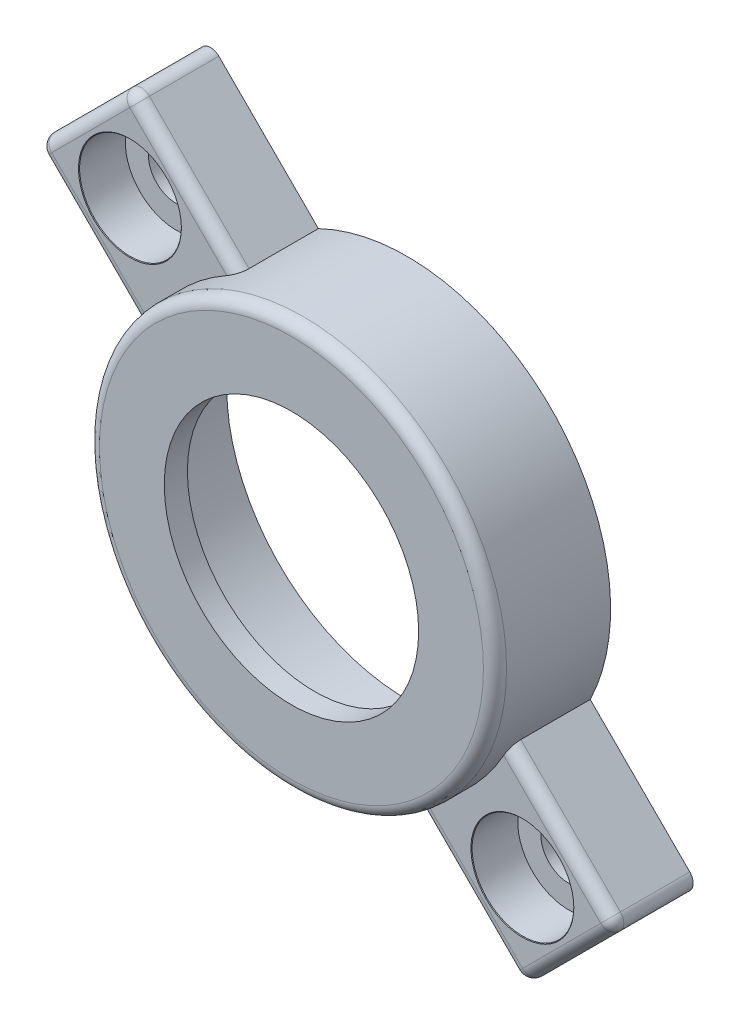
ISO-10303-21;
HEADER;
FILE_DESCRIPTION(('STEP AP214'),'2;1');
FILE_NAME('part.step','',(''),(''),'','','');
FILE_SCHEMA(('AUTOMOTIVE_DESIGN { 1 0 10303 214 1 1 1 1 }'));
ENDSEC;
DATA;
#1=APPLICATION_CONTEXT('core data for automotive mechanical design processes');
#2=APPLICATION_PROTOCOL_DEFINITION('international standard','automotive_design',2000,#1);
#3=PRODUCT_CONTEXT('',#1,'mechanical');
#4=PRODUCT('Part','Part','',(#3));
#5=PRODUCT_RELATED_PRODUCT_CATEGORY('part','',(#4));
#6=PRODUCT_DEFINITION_FORMATION('','',#4);
#7=PRODUCT_DEFINITION_CONTEXT('part definition',#1,'design');
#8=PRODUCT_DEFINITION('design','',#6,#7);
#9=PRODUCT_DEFINITION_SHAPE('','',#8);
#10=(LENGTH_UNIT() NAMED_UNIT(*) SI_UNIT(.MILLI.,.METRE.));
#11=(NAMED_UNIT(*) PLANE_ANGLE_UNIT() SI_UNIT($,.RADIAN.));
#12=(NAMED_UNIT(*) SI_UNIT($,.STERADIAN.) SOLID_ANGLE_UNIT());
#13=UNCERTAINTY_MEASURE_WITH_UNIT(LENGTH_MEASURE(1.E-05),#10,'distance_accuracy_value','');
#14=(GEOMETRIC_REPRESENTATION_CONTEXT(3) GLOBAL_UNCERTAINTY_ASSIGNED_CONTEXT((#13)) GLOBAL_UNIT_ASSIGNED_CONTEXT((#10,
#11,#12)) REPRESENTATION_CONTEXT('',''));
#15=CARTESIAN_POINT('',(0.,0.,0.));
#16=DIRECTION('',(0.,0.,1.));
#17=DIRECTION('',(1.,0.,0.));
#18=AXIS2_PLACEMENT_3D('',#15,#16,#17);
#19=CARTESIAN_POINT('',(0.,0.,5.));
#20=DIRECTION('',(0.,0.,-1.));
#21=DIRECTION('',(-1.,0.,0.));
#22=AXIS2_PLACEMENT_3D('',#19,#20,#21);
#23=CYLINDRICAL_SURFACE('',#22,8.8);
#24=CARTESIAN_POINT('',(0.,0.,4.5));
#25=DIRECTION('',(0.,0.,1.));
#26=DIRECTION('',(1.,0.,0.));
#27=AXIS2_PLACEMENT_3D('',#24,#25,#26);
#28=CIRCLE('',#27,8.8);
#29=CARTESIAN_POINT('',(8.8,0.,4.5));
#30=VERTEX_POINT('',#29);
#31=EDGE_CURVE('E206',#30,#30,#28,.F.);
#32=ORIENTED_EDGE('',*,*,#31,.T.);
#33=EDGE_LOOP('',(#32));
#34=FACE_BOUND('',#33,.T.);
#35=CARTESIAN_POINT('',(0.,0.,0.));
#36=DIRECTION('',(0.,0.,1.));
#37=DIRECTION('',(1.,0.,0.));
#38=AXIS2_PLACEMENT_3D('',#35,#36,#37);
#39=CIRCLE('',#38,8.8);
#40=CARTESIAN_POINT('',(-7.91995561386818,3.83592271485725,0.));
#41=VERTEX_POINT('',#40);
#42=CARTESIAN_POINT('',(3.8359227148572,-7.91995561386821,0.));
#43=VERTEX_POINT('',#42);
#44=EDGE_CURVE('E192',#41,#43,#39,.T.);
#45=ORIENTED_EDGE('',*,*,#44,.T.);
#46=DIRECTION('',(0.,0.,-1.));
#47=VECTOR('',#46,1.);
#48=CARTESIAN_POINT('',(3.8359227148572,-7.91995561386821,3.5));
#49=LINE('',#48,#47);
#50=CARTESIAN_POINT('',(3.8359227148572,-7.91995561386821,3.));
#51=VERTEX_POINT('',#50);
#52=EDGE_CURVE('E184',#51,#43,#49,.T.);
#53=ORIENTED_EDGE('',*,*,#52,.F.);
#54=CARTESIAN_POINT('',(3.8359227148572,-7.91995561386821,3.));
#55=CARTESIAN_POINT('',(3.83589307034447,-7.91996600417581,3.02706634278127));
#56=CARTESIAN_POINT('',(3.83801477132745,-7.91894232403933,3.05411490016184));
#57=CARTESIAN_POINT('',(3.8463298883438,-7.91490897848175,3.10736088939439));
#58=CARTESIAN_POINT('',(3.85251327022096,-7.91190420716805,3.13356025218955));
#59=CARTESIAN_POINT('',(3.86872162558122,-7.90399069907808,3.18442914207294));
#60=CARTESIAN_POINT('',(3.8787460323447,-7.89908224317747,3.20909889422228));
#61=CARTESIAN_POINT('',(3.90224925124192,-7.88749789364705,3.25628559948586));
#62=CARTESIAN_POINT('',(3.91572915892654,-7.8808214394592,3.27880186673306));
#63=CARTESIAN_POINT('',(3.94606868441997,-7.86567451344434,3.32169316164555));
#64=CARTESIAN_POINT('',(3.96300647750629,-7.85716222625641,3.34199801724509));
#65=CARTESIAN_POINT('',(3.9994856726128,-7.83865628567551,3.37933076930461));
#66=CARTESIAN_POINT('',(4.01902785921082,-7.82866218578152,3.39635767448321));
#67=CARTESIAN_POINT('',(4.06119700822396,-7.806873218743,3.42755625430859));
#68=CARTESIAN_POINT('',(4.08393049083422,-7.7950124886105,3.44153791638332));
#69=CARTESIAN_POINT('',(4.13098065695736,-7.77018056625771,3.46517914177813));
#70=CARTESIAN_POINT('',(4.1552971724879,-7.75720949181491,3.4748391628323));
#71=CARTESIAN_POINT('',(4.19981211064155,-7.73318049771603,3.48811888764315));
#72=CARTESIAN_POINT('',(4.21984647073165,-7.72226755317064,3.49256594864601));
#73=CARTESIAN_POINT('',(4.2601397293333,-7.70011339232452,3.49850713601997));
#74=CARTESIAN_POINT('',(4.28039835035997,-7.68887255851719,3.50000457360893));
#75=CARTESIAN_POINT('',(4.30061804745866,-7.67754416528312,3.5));
#76=B_SPLINE_CURVE_WITH_KNOTS('',3,(#54,#55,#56,#57,#58,#59,#60,#61,#62,#63,#64,#65,#66,#67,#68,
#69,#70,#71,#72,#73,#74,#75),.UNSPECIFIED.,.F.,.F.,(4,2,2,2,2,2,2,2,2,2,4),(0.,
0.0810692484083578,0.161938969204339,0.242796762761334,0.323680223689289,0.40664901721923,
0.489642861973184,0.576871359676845,0.664090616234582,0.733635085488818,0.803101440221302),.UNSPECIFIED.);
#77=CARTESIAN_POINT('',(4.30061804745866,-7.67754416528312,3.5));
#78=VERTEX_POINT('',#77);
#79=EDGE_CURVE('E11',#51,#78,#76,.T.);
#80=ORIENTED_EDGE('',*,*,#79,.T.);
#81=CARTESIAN_POINT('',(0.,0.,3.5));
#82=DIRECTION('',(0.,0.,1.));
#83=DIRECTION('',(1.,0.,0.));
#84=AXIS2_PLACEMENT_3D('',#81,#82,#83);
#85=CIRCLE('',#84,8.8);
#86=CARTESIAN_POINT('',(7.67754416528312,-4.30061804745865,3.5));
#87=VERTEX_POINT('',#86);
#88=EDGE_CURVE('E173',#78,#87,#85,.T.);
#89=ORIENTED_EDGE('',*,*,#88,.T.);
#90=CARTESIAN_POINT('',(7.67754416528312,-4.30061804745865,3.5));
#91=CARTESIAN_POINT('',(7.69239130558122,-4.27412495728988,3.50001798088771));
#92=CARTESIAN_POINT('',(7.70708703154954,-4.24755621536626,3.49743772900287));
#93=CARTESIAN_POINT('',(7.73580463075034,-4.1950202341839,3.48725917887673));
#94=CARTESIAN_POINT('',(7.74982648187858,-4.16905301467057,3.47966071614995));
#95=CARTESIAN_POINT('',(7.77683092664298,-4.11846227802681,3.45961925682563));
#96=CARTESIAN_POINT('',(7.78981300557566,-4.09383942827666,3.44717387858157));
#97=CARTESIAN_POINT('',(7.81439839004262,-4.04671256308781,3.41774628657881));
#98=CARTESIAN_POINT('',(7.82600210275842,-4.02420792232142,3.40076541748349));
#99=CARTESIAN_POINT('',(7.84740952026313,-3.98229993880003,3.36288932243528));
#100=CARTESIAN_POINT('',(7.85723193962856,-3.96286466752868,3.34204009540808));
#101=CARTESIAN_POINT('',(7.87496625121789,-3.92750541784252,3.29682941655514));
#102=CARTESIAN_POINT('',(7.88287811504157,-3.91158149162381,3.27246791252833));
#103=CARTESIAN_POINT('',(7.89625486200306,-3.88450488849055,3.22204415076297));
#104=CARTESIAN_POINT('',(7.90181049240829,-3.87317619053987,3.19610040566682));
#105=CARTESIAN_POINT('',(7.9107766125548,-3.85483060751618,3.1423983489206));
#106=CARTESIAN_POINT('',(7.91419010220146,-3.84780769283975,3.11464263524664));
#107=CARTESIAN_POINT('',(7.9176359441669,-3.84070921759787,3.07218141213826));
#108=CARTESIAN_POINT('',(7.91850556675559,-3.83891550580424,3.05780798615238));
#109=CARTESIAN_POINT('',(7.91966500579357,-3.83652278332807,3.02895897925885));
#110=CARTESIAN_POINT('',(7.91995562415094,-3.83592212030286,3.01448356754118));
#111=CARTESIAN_POINT('',(7.91995561386827,-3.83592271485721,3.));
#112=B_SPLINE_CURVE_WITH_KNOTS('',3,(#90,#91,#92,#93,#94,#95,#96,#97,#98,#99,#100,#101,#102,
#103,#104,#105,#106,#107,#108,#109,#110,#111),.UNSPECIFIED.,.F.,.F.,(4,2,2,2,2,2,2,2,2,2,4),(0.,
0.0909891913649377,0.18198136529573,0.273018306909071,0.36402828817203,0.454018363278204,
0.544009775995821,0.630123601092977,0.716116559613162,0.759596167160493,0.803015514433935),.UNSPECIFIED.);
#113=CARTESIAN_POINT('',(7.91995561386821,-3.8359227148572,3.));
#114=VERTEX_POINT('',#113);
#115=EDGE_CURVE('E56',#87,#114,#112,.T.);
#116=ORIENTED_EDGE('',*,*,#115,.T.);
#117=DIRECTION('',(0.,0.,-1.));
#118=VECTOR('',#117,1.);
#119=CARTESIAN_POINT('',(7.91995561386821,-3.8359227148572,3.5));
#120=LINE('',#119,#118);
#121=CARTESIAN_POINT('',(7.91995561386821,-3.8359227148572,0.));
#122=VERTEX_POINT('',#121);
#123=EDGE_CURVE('E166',#114,#122,#120,.T.);
#124=ORIENTED_EDGE('',*,*,#123,.T.);
#125=CARTESIAN_POINT('',(-3.83592271485714,7.91995561386824,0.));
#126=VERTEX_POINT('',#125);
#127=EDGE_CURVE('E180',#122,#126,#39,.T.);
#128=ORIENTED_EDGE('',*,*,#127,.T.);
#129=DIRECTION('',(0.,0.,-1.));
#130=VECTOR('',#129,1.);
#131=CARTESIAN_POINT('',(-3.83592271485714,7.91995561386824,3.5));
#132=LINE('',#131,#130);
#133=CARTESIAN_POINT('',(-3.83592271485714,7.91995561386824,3.));
#134=VERTEX_POINT('',#133);
#135=EDGE_CURVE('E478',#134,#126,#132,.T.);
#136=ORIENTED_EDGE('',*,*,#135,.F.);
#137=CARTESIAN_POINT('',(-3.83592271485714,7.91995561386824,3.));
#138=CARTESIAN_POINT('',(-3.83589307034441,7.91996600417584,3.02706634278127));
#139=CARTESIAN_POINT('',(-3.8380147713274,7.91894232403936,3.05411490016184));
#140=CARTESIAN_POINT('',(-3.84632988834374,7.91490897848178,3.10736088939439));
#141=CARTESIAN_POINT('',(-3.8525132702209,7.91190420716808,3.13356025218955));
#142=CARTESIAN_POINT('',(-3.86872162558117,7.9039906990781,3.18442914207294));
#143=CARTESIAN_POINT('',(-3.87874603234464,7.8990822431775,3.20909889422228));
#144=CARTESIAN_POINT('',(-3.90224925124186,7.88749789364708,3.25628559948586));
#145=CARTESIAN_POINT('',(-3.91572915892649,7.88082143945923,3.27880186673306));
#146=CARTESIAN_POINT('',(-3.94606868441991,7.86567451344437,3.32169316164555));
#147=CARTESIAN_POINT('',(-3.96300647750623,7.85716222625643,3.34199801724509));
#148=CARTESIAN_POINT('',(-3.99948567261275,7.83865628567554,3.37933076930461));
#149=CARTESIAN_POINT('',(-4.01902785921076,7.82866218578155,3.39635767448321));
#150=CARTESIAN_POINT('',(-4.06119700822391,7.80687321874303,3.42755625430859));
#151=CARTESIAN_POINT('',(-4.08393049083416,7.79501248861053,3.44153791638333));
#152=CARTESIAN_POINT('',(-4.1309806569573,7.77018056625773,3.46517914177814));
#153=CARTESIAN_POINT('',(-4.15529717248785,7.75720949181494,3.4748391628323));
#154=CARTESIAN_POINT('',(-4.19981211064149,7.73318049771606,3.48811888764315));
#155=CARTESIAN_POINT('',(-4.21984647073159,7.72226755317066,3.49256594864601));
#156=CARTESIAN_POINT('',(-4.26013972933325,7.70011339232455,3.49850713601997));
#157=CARTESIAN_POINT('',(-4.28039835035992,7.68887255851722,3.50000457360893));
#158=CARTESIAN_POINT('',(-4.3006180474586,7.67754416528315,3.5));
#159=B_SPLINE_CURVE_WITH_KNOTS('',3,(#137,#138,#139,#140,#141,#142,#143,#144,#145,#146,#147,
#148,#149,#150,#151,#152,#153,#154,#155,#156,#157,#158),.UNSPECIFIED.,.F.,.F.,(4,2,2,2,2,2,2,2,
2,2,4),(0.,0.0810692484083578,0.161938969204339,0.242796762761334,0.323680223689289,
0.406649017219229,0.489642861973184,0.576871359676845,0.664090616234583,0.733635085488818,
0.803101440221302),.UNSPECIFIED.);
#160=CARTESIAN_POINT('',(-4.3006180474586,7.67754416528315,3.5));
#161=VERTEX_POINT('',#160);
#162=EDGE_CURVE('E280',#134,#161,#159,.T.);
#163=ORIENTED_EDGE('',*,*,#162,.T.);
#164=CARTESIAN_POINT('',(0.,0.,3.5));
#165=DIRECTION('',(0.,0.,1.));
#166=DIRECTION('',(1.,0.,0.));
#167=AXIS2_PLACEMENT_3D('',#164,#165,#166);
#168=CIRCLE('',#167,8.8);
#169=CARTESIAN_POINT('',(-7.67754416528309,4.30061804745871,3.5));
#170=VERTEX_POINT('',#169);
#171=EDGE_CURVE('E474',#161,#170,#168,.T.);
#172=ORIENTED_EDGE('',*,*,#171,.T.);
#173=CARTESIAN_POINT('',(-7.67754416528309,4.30061804745871,3.5));
#174=CARTESIAN_POINT('',(-7.69239130558119,4.27412495728994,3.50001798088771));
#175=CARTESIAN_POINT('',(-7.7070870315495,4.24755621536632,3.49743772900287));
#176=CARTESIAN_POINT('',(-7.73580463075031,4.19502023418396,3.48725917887673));
#177=CARTESIAN_POINT('',(-7.74982648187855,4.16905301467063,3.47966071614995));
#178=CARTESIAN_POINT('',(-7.77683092664295,4.11846227802687,3.45961925682563));
#179=CARTESIAN_POINT('',(-7.78981300557563,4.09383942827671,3.44717387858158));
#180=CARTESIAN_POINT('',(-7.81439839004259,4.04671256308786,3.41774628657881));
#181=CARTESIAN_POINT('',(-7.82600210275839,4.02420792232147,3.40076541748349));
#182=CARTESIAN_POINT('',(-7.8474095202631,3.98229993880008,3.36288932243528));
#183=CARTESIAN_POINT('',(-7.85723193962853,3.96286466752874,3.34204009540809));
#184=CARTESIAN_POINT('',(-7.87496625121786,3.92750541784258,3.29682941655514));
#185=CARTESIAN_POINT('',(-7.88287811504155,3.91158149162387,3.27246791252833));
#186=CARTESIAN_POINT('',(-7.89625486200304,3.8845048884906,3.22204415076297));
#187=CARTESIAN_POINT('',(-7.90181049240826,3.87317619053993,3.19610040566682));
#188=CARTESIAN_POINT('',(-7.91077661255477,3.85483060751623,3.1423983489206));
#189=CARTESIAN_POINT('',(-7.91419010220143,3.84780769283981,3.11464263524664));
#190=CARTESIAN_POINT('',(-7.91763594416687,3.84070921759792,3.07218141213826));
#191=CARTESIAN_POINT('',(-7.91850556675556,3.8389155058043,3.05780798615238));
#192=CARTESIAN_POINT('',(-7.91966500579355,3.83652278332813,3.02895897925885));
#193=CARTESIAN_POINT('',(-7.91995562415091,3.83592212030292,3.01448356754118));
#194=CARTESIAN_POINT('',(-7.91995561386824,3.83592271485727,3.));
#195=B_SPLINE_CURVE_WITH_KNOTS('',3,(#173,#174,#175,#176,#177,#178,#179,#180,#181,#182,#183,
#184,#185,#186,#187,#188,#189,#190,#191,#192,#193,#194),.UNSPECIFIED.,.F.,.F.,(4,2,2,2,2,2,2,2,
2,2,4),(0.,0.0909891913649376,0.181981365295729,0.273018306909072,0.364028288172031,
0.454018363278203,0.544009775995821,0.630123601092978,0.716116559613162,0.759596167160494,
0.803015514433936),.UNSPECIFIED.);
#196=CARTESIAN_POINT('',(-7.91995561386818,3.83592271485725,3.));
#197=VERTEX_POINT('',#196);
#198=EDGE_CURVE('E289',#170,#197,#195,.T.);
#199=ORIENTED_EDGE('',*,*,#198,.T.);
#200=DIRECTION('',(0.,0.,-1.));
#201=VECTOR('',#200,1.);
#202=CARTESIAN_POINT('',(-7.91995561386818,3.83592271485725,3.5));
#203=LINE('',#202,#201);
#204=EDGE_CURVE('E467',#197,#41,#203,.T.);
#205=ORIENTED_EDGE('',*,*,#204,.T.);
#206=EDGE_LOOP('',(#45,#53,#80,#89,#116,#124,#128,#136,#163,#172,#199,#205));
#207=FACE_BOUND('',#206,.T.);
#208=ADVANCED_FACE('F46',(#34,#207),#23,.T.);
#209=CARTESIAN_POINT('',(0.,0.,5.));
#210=DIRECTION('',(0.,0.,1.));
#211=DIRECTION('',(1.,0.,0.));
#212=AXIS2_PLACEMENT_3D('',#209,#210,#211);
#213=PLANE('',#212);
#214=CARTESIAN_POINT('',(0.,0.,5.));
#215=DIRECTION('',(0.,0.,1.));
#216=DIRECTION('',(1.,0.,0.));
#217=AXIS2_PLACEMENT_3D('',#214,#215,#216);
#218=CIRCLE('',#217,5.5);
#219=CARTESIAN_POINT('',(5.5,0.,5.));
#220=VERTEX_POINT('',#219);
#221=EDGE_CURVE('E585',#220,#220,#218,.T.);
#222=ORIENTED_EDGE('',*,*,#221,.F.);
#223=EDGE_LOOP('',(#222));
#224=FACE_BOUND('',#223,.T.);
#225=CARTESIAN_POINT('',(0.,0.,5.));
#226=DIRECTION('',(0.,0.,1.));
#227=DIRECTION('',(1.,0.,0.));
#228=AXIS2_PLACEMENT_3D('',#225,#226,#227);
#229=CIRCLE('',#228,8.3);
#230=CARTESIAN_POINT('',(8.3,0.,5.));
#231=VERTEX_POINT('',#230);
#232=EDGE_CURVE('E197',#231,#231,#229,.T.);
#233=ORIENTED_EDGE('',*,*,#232,.T.);
#234=EDGE_LOOP('',(#233));
#235=FACE_BOUND('',#234,.T.);
#236=ADVANCED_FACE('F361',(#224,#235),#213,.T.);
#237=CARTESIAN_POINT('',(0.,0.,0.));
#238=DIRECTION('',(0.,0.,1.));
#239=DIRECTION('',(1.,0.,0.));
#240=AXIS2_PLACEMENT_3D('',#237,#238,#239);
#241=PLANE('',#240);
#242=CARTESIAN_POINT('',(8.485,-8.48500000000022,0.));
#243=DIRECTION('',(0.,0.,1.));
#244=DIRECTION('',(1.,0.,0.));
#245=AXIS2_PLACEMENT_3D('',#242,#243,#244);
#246=CIRCLE('',#245,1.2);
#247=CARTESIAN_POINT('',(9.685,-8.48500000000022,0.));
#248=VERTEX_POINT('',#247);
#249=EDGE_CURVE('E540',#248,#248,#246,.T.);
#250=ORIENTED_EDGE('',*,*,#249,.T.);
#251=EDGE_LOOP('',(#250));
#252=FACE_BOUND('',#251,.T.);
#253=CARTESIAN_POINT('',(-8.485,8.48499999999978,0.));
#254=DIRECTION('',(0.,0.,1.));
#255=DIRECTION('',(1.,0.,0.));
#256=AXIS2_PLACEMENT_3D('',#253,#254,#255);
#257=CIRCLE('',#256,1.2);
#258=CARTESIAN_POINT('',(-7.285,8.48499999999978,0.));
#259=VERTEX_POINT('',#258);
#260=EDGE_CURVE('E462',#259,#259,#257,.T.);
#261=ORIENTED_EDGE('',*,*,#260,.T.);
#262=EDGE_LOOP('',(#261));
#263=FACE_BOUND('',#262,.T.);
#264=CARTESIAN_POINT('',(0.,0.,0.));
#265=DIRECTION('',(0.,0.,1.));
#266=DIRECTION('',(1.,0.,0.));
#267=AXIS2_PLACEMENT_3D('',#264,#265,#266);
#268=CIRCLE('',#267,7.8);
#269=CARTESIAN_POINT('',(7.8,0.,0.));
#270=VERTEX_POINT('',#269);
#271=EDGE_CURVE('E199',#270,#270,#268,.T.);
#272=ORIENTED_EDGE('',*,*,#271,.T.);
#273=EDGE_LOOP('',(#272));
#274=FACE_BOUND('',#273,.T.);
#275=DIRECTION('',(-0.707106781186553,-0.707106781186542,0.));
#276=VECTOR('',#275,1.);
#277=CARTESIAN_POINT('',(-10.535572479178,10.5355724791781,0.));
#278=LINE('',#277,#276);
#279=CARTESIAN_POINT('',(-8.84710942026572,12.2240355380903,0.));
#280=VERTEX_POINT('',#279);
#281=CARTESIAN_POINT('',(-12.2240355380902,8.84710942026589,0.));
#282=VERTEX_POINT('',#281);
#283=EDGE_CURVE('E479',#280,#282,#278,.T.);
#284=ORIENTED_EDGE('',*,*,#283,.F.);
#285=CARTESIAN_POINT('',(-8.49355602967245,11.8704821474971,0.));
#286=DIRECTION('',(0.,0.,1.));
#287=DIRECTION('',(1.,0.,0.));
#288=AXIS2_PLACEMENT_3D('',#285,#286,#287);
#289=CIRCLE('',#288,0.5);
#290=CARTESIAN_POINT('',(-8.14000263907918,12.2240355380903,0.));
#291=VERTEX_POINT('',#290);
#292=EDGE_CURVE('E229',#280,#291,#289,.F.);
#293=ORIENTED_EDGE('',*,*,#292,.T.);
#294=DIRECTION('',(0.707106781186543,-0.707106781186553,0.));
#295=VECTOR('',#294,1.);
#296=CARTESIAN_POINT('',(2.04201644950552,2.04201644950549,0.));
#297=LINE('',#296,#295);
#298=EDGE_CURVE('E189',#291,#126,#297,.T.);
#299=ORIENTED_EDGE('',*,*,#298,.T.);
#300=ORIENTED_EDGE('',*,*,#127,.F.);
#301=DIRECTION('',(-0.707106781186548,0.707106781186547,0.));
#302=VECTOR('',#301,1.);
#303=CARTESIAN_POINT('',(2.0420164495055,2.04201644950551,0.));
#304=LINE('',#303,#302);
#305=CARTESIAN_POINT('',(12.2240355380903,-8.14000263907926,0.));
#306=VERTEX_POINT('',#305);
#307=EDGE_CURVE('E163',#306,#122,#304,.T.);
#308=ORIENTED_EDGE('',*,*,#307,.F.);
#309=CARTESIAN_POINT('',(11.870482147497,-8.49355602967253,0.));
#310=DIRECTION('',(0.,0.,1.));
#311=DIRECTION('',(1.,0.,0.));
#312=AXIS2_PLACEMENT_3D('',#309,#310,#311);
#313=CIRCLE('',#312,0.5);
#314=CARTESIAN_POINT('',(12.2240355380903,-8.8471094202658,0.));
#315=VERTEX_POINT('',#314);
#316=EDGE_CURVE('E223',#306,#315,#313,.F.);
#317=ORIENTED_EDGE('',*,*,#316,.T.);
#318=DIRECTION('',(0.707106781186548,0.707106781186548,0.));
#319=VECTOR('',#318,1.);
#320=CARTESIAN_POINT('',(10.535572479178,-10.535572479178,0.));
#321=LINE('',#320,#319);
#322=CARTESIAN_POINT('',(8.84710942026581,-12.2240355380903,0.));
#323=VERTEX_POINT('',#322);
#324=EDGE_CURVE('E174',#323,#315,#321,.T.);
#325=ORIENTED_EDGE('',*,*,#324,.F.);
#326=CARTESIAN_POINT('',(8.49355602967253,-11.870482147497,0.));
#327=DIRECTION('',(0.,0.,1.));
#328=DIRECTION('',(1.,0.,0.));
#329=AXIS2_PLACEMENT_3D('',#326,#327,#328);
#330=CIRCLE('',#329,0.5);
#331=CARTESIAN_POINT('',(8.14000263907926,-12.2240355380903,0.));
#332=VERTEX_POINT('',#331);
#333=EDGE_CURVE('E220',#323,#332,#330,.F.);
#334=ORIENTED_EDGE('',*,*,#333,.T.);
#335=DIRECTION('',(-0.707106781186548,0.707106781186548,0.));
#336=VECTOR('',#335,1.);
#337=CARTESIAN_POINT('',(-2.0420164495055,-2.0420164495055,0.));
#338=LINE('',#337,#336);
#339=EDGE_CURVE('E464',#332,#43,#338,.T.);
#340=ORIENTED_EDGE('',*,*,#339,.T.);
#341=ORIENTED_EDGE('',*,*,#44,.F.);
#342=DIRECTION('',(0.707106781186543,-0.707106781186552,0.));
#343=VECTOR('',#342,1.);
#344=CARTESIAN_POINT('',(-2.04201644950552,-2.04201644950549,0.));
#345=LINE('',#344,#343);
#346=CARTESIAN_POINT('',(-12.2240355380902,8.14000263907935,0.));
#347=VERTEX_POINT('',#346);
#348=EDGE_CURVE('E480',#347,#41,#345,.T.);
#349=ORIENTED_EDGE('',*,*,#348,.F.);
#350=CARTESIAN_POINT('',(-11.8704821474969,8.49355602967262,0.));
#351=DIRECTION('',(0.,0.,1.));
#352=DIRECTION('',(1.,0.,0.));
#353=AXIS2_PLACEMENT_3D('',#350,#351,#352);
#354=CIRCLE('',#353,0.5);
#355=EDGE_CURVE('E226',#347,#282,#354,.F.);
#356=ORIENTED_EDGE('',*,*,#355,.T.);
#357=EDGE_LOOP('',(#284,#293,#299,#300,#308,#317,#325,#334,#340,#341,#349,#356));
#358=FACE_BOUND('',#357,.T.);
#359=ADVANCED_FACE('F187',(#252,#263,#274,#358),#241,.F.);
#360=CARTESIAN_POINT('',(0.,0.,5.));
#361=DIRECTION('',(0.,0.,-1.));
#362=DIRECTION('',(-1.,0.,0.));
#363=AXIS2_PLACEMENT_3D('',#360,#361,#362);
#364=CYLINDRICAL_SURFACE('',#363,7.8);
#365=CARTESIAN_POINT('',(0.,0.,4.));
#366=DIRECTION('',(0.,0.,1.));
#367=DIRECTION('',(1.,0.,0.));
#368=AXIS2_PLACEMENT_3D('',#365,#366,#367);
#369=CIRCLE('',#368,7.8);
#370=CARTESIAN_POINT('',(7.8,0.,4.));
#371=VERTEX_POINT('',#370);
#372=EDGE_CURVE('E193',#371,#371,#369,.T.);
#373=ORIENTED_EDGE('',*,*,#372,.T.);
#374=EDGE_LOOP('',(#373));
#375=FACE_BOUND('',#374,.T.);
#376=ORIENTED_EDGE('',*,*,#271,.F.);
#377=EDGE_LOOP('',(#376));
#378=FACE_BOUND('',#377,.T.);
#379=ADVANCED_FACE('F528',(#375,#378),#364,.F.);
#380=CARTESIAN_POINT('',(0.,0.,4.));
#381=DIRECTION('',(0.,0.,1.));
#382=DIRECTION('',(1.,0.,0.));
#383=AXIS2_PLACEMENT_3D('',#380,#381,#382);
#384=PLANE('',#383);
#385=CARTESIAN_POINT('',(0.,0.,4.));
#386=DIRECTION('',(0.,0.,1.));
#387=DIRECTION('',(1.,0.,0.));
#388=AXIS2_PLACEMENT_3D('',#385,#386,#387);
#389=CIRCLE('',#388,5.5);
#390=CARTESIAN_POINT('',(5.5,0.,4.));
#391=VERTEX_POINT('',#390);
#392=EDGE_CURVE('E50',#391,#391,#389,.T.);
#393=ORIENTED_EDGE('',*,*,#392,.T.);
#394=EDGE_LOOP('',(#393));
#395=FACE_BOUND('',#394,.T.);
#396=ORIENTED_EDGE('',*,*,#372,.F.);
#397=EDGE_LOOP('',(#396));
#398=FACE_BOUND('',#397,.T.);
#399=ADVANCED_FACE('F527',(#395,#398),#384,.F.);
#400=CARTESIAN_POINT('',(-2.04201644950552,-2.04201644950549,3.5));
#401=DIRECTION('',(0.707106781186552,0.707106781186543,0.));
#402=DIRECTION('',(-0.707106781186543,0.707106781186552,0.));
#403=AXIS2_PLACEMENT_3D('',#400,#401,#402);
#404=PLANE('',#403);
#405=DIRECTION('',(0.707106781186543,-0.707106781186552,0.));
#406=VECTOR('',#405,1.);
#407=CARTESIAN_POINT('',(-12.5775889286835,8.49355602967262,3.));
#408=LINE('',#407,#406);
#409=CARTESIAN_POINT('',(-12.2240355380902,8.14000263907934,3.));
#410=VERTEX_POINT('',#409);
#411=EDGE_CURVE('E247',#197,#410,#408,.F.);
#412=ORIENTED_EDGE('',*,*,#411,.T.);
#413=DIRECTION('',(0.,0.,-1.));
#414=VECTOR('',#413,1.);
#415=CARTESIAN_POINT('',(-12.2240355380902,8.14000263907935,3.5));
#416=LINE('',#415,#414);
#417=EDGE_CURVE('E250',#410,#347,#416,.T.);
#418=ORIENTED_EDGE('',*,*,#417,.T.);
#419=ORIENTED_EDGE('',*,*,#348,.T.);
#420=ORIENTED_EDGE('',*,*,#204,.F.);
#421=EDGE_LOOP('',(#412,#418,#419,#420));
#422=FACE_BOUND('',#421,.T.);
#423=ADVANCED_FACE('F523',(#422),#404,.F.);
#424=CARTESIAN_POINT('',(2.04201644950552,2.04201644950549,3.5));
#425=DIRECTION('',(0.707106781186553,0.707106781186543,0.));
#426=DIRECTION('',(-0.707106781186543,0.707106781186553,0.));
#427=AXIS2_PLACEMENT_3D('',#424,#425,#426);
#428=PLANE('',#427);
#429=ORIENTED_EDGE('',*,*,#298,.F.);
#430=DIRECTION('',(0.,0.,-1.));
#431=VECTOR('',#430,1.);
#432=CARTESIAN_POINT('',(-8.14000263907917,12.2240355380903,3.5));
#433=LINE('',#432,#431);
#434=CARTESIAN_POINT('',(-8.14000263907917,12.2240355380903,3.));
#435=VERTEX_POINT('',#434);
#436=EDGE_CURVE('E235',#291,#435,#433,.F.);
#437=ORIENTED_EDGE('',*,*,#436,.T.);
#438=DIRECTION('',(0.707106781186543,-0.707106781186553,0.));
#439=VECTOR('',#438,1.);
#440=CARTESIAN_POINT('',(2.04201644950552,2.04201644950549,3.));
#441=LINE('',#440,#439);
#442=EDGE_CURVE('E232',#435,#134,#441,.T.);
#443=ORIENTED_EDGE('',*,*,#442,.T.);
#444=ORIENTED_EDGE('',*,*,#135,.T.);
#445=EDGE_LOOP('',(#429,#437,#443,#444));
#446=FACE_BOUND('',#445,.T.);
#447=ADVANCED_FACE('F519',(#446),#428,.T.);
#448=CARTESIAN_POINT('',(-10.535572479178,10.5355724791781,3.5));
#449=DIRECTION('',(0.707106781186543,-0.707106781186553,0.));
#450=DIRECTION('',(0.707106781186553,0.707106781186543,0.));
#451=AXIS2_PLACEMENT_3D('',#448,#449,#450);
#452=PLANE('',#451);
#453=DIRECTION('',(-0.707106781186553,-0.707106781186543,0.));
#454=VECTOR('',#453,1.);
#455=CARTESIAN_POINT('',(-8.49355602967244,12.5775889286836,3.));
#456=LINE('',#455,#454);
#457=CARTESIAN_POINT('',(-12.2240355380902,8.84710942026589,3.));
#458=VERTEX_POINT('',#457);
#459=CARTESIAN_POINT('',(-8.84710942026572,12.2240355380903,3.));
#460=VERTEX_POINT('',#459);
#461=EDGE_CURVE('E213',#458,#460,#456,.F.);
#462=ORIENTED_EDGE('',*,*,#461,.T.);
#463=DIRECTION('',(0.,0.,-1.));
#464=VECTOR('',#463,1.);
#465=CARTESIAN_POINT('',(-8.84710942026572,12.2240355380903,0.));
#466=LINE('',#465,#464);
#467=EDGE_CURVE('E216',#460,#280,#466,.T.);
#468=ORIENTED_EDGE('',*,*,#467,.T.);
#469=ORIENTED_EDGE('',*,*,#283,.T.);
#470=DIRECTION('',(0.,0.,-1.));
#471=VECTOR('',#470,1.);
#472=CARTESIAN_POINT('',(-12.2240355380902,8.84710942026589,3.5));
#473=LINE('',#472,#471);
#474=EDGE_CURVE('E210',#282,#458,#473,.F.);
#475=ORIENTED_EDGE('',*,*,#474,.T.);
#476=EDGE_LOOP('',(#462,#468,#469,#475));
#477=FACE_BOUND('',#476,.T.);
#478=ADVANCED_FACE('F512',(#477),#452,.F.);
#479=CARTESIAN_POINT('',(0.,0.,3.5));
#480=DIRECTION('',(0.,0.,1.));
#481=DIRECTION('',(1.,0.,0.));
#482=AXIS2_PLACEMENT_3D('',#479,#480,#481);
#483=PLANE('',#482);
#484=CARTESIAN_POINT('',(-8.485,8.48499999999978,3.5));
#485=DIRECTION('',(0.,0.,1.));
#486=DIRECTION('',(1.,0.,0.));
#487=AXIS2_PLACEMENT_3D('',#484,#485,#486);
#488=CIRCLE('',#487,2.225);
#489=CARTESIAN_POINT('',(-6.26,8.48499999999978,3.5));
#490=VERTEX_POINT('',#489);
#491=EDGE_CURVE('E564',#490,#490,#488,.T.);
#492=ORIENTED_EDGE('',*,*,#491,.F.);
#493=EDGE_LOOP('',(#492));
#494=FACE_BOUND('',#493,.T.);
#495=ORIENTED_EDGE('',*,*,#171,.F.);
#496=DIRECTION('',(0.707106781186543,-0.707106781186553,0.));
#497=VECTOR('',#496,1.);
#498=CARTESIAN_POINT('',(1.68846305891224,1.68846305891222,3.5));
#499=LINE('',#498,#497);
#500=CARTESIAN_POINT('',(-8.49355602967245,11.8704821474971,3.5));
#501=VERTEX_POINT('',#500);
#502=EDGE_CURVE('E244',#161,#501,#499,.F.);
#503=ORIENTED_EDGE('',*,*,#502,.T.);
#504=DIRECTION('',(-0.707106781186553,-0.707106781186543,0.));
#505=VECTOR('',#504,1.);
#506=CARTESIAN_POINT('',(-12.2240355380902,8.14000263907935,3.5));
#507=LINE('',#506,#505);
#508=CARTESIAN_POINT('',(-11.8704821474969,8.49355602967262,3.5));
#509=VERTEX_POINT('',#508);
#510=EDGE_CURVE('E241',#501,#509,#507,.T.);
#511=ORIENTED_EDGE('',*,*,#510,.T.);
#512=DIRECTION('',(0.707106781186543,-0.707106781186552,0.));
#513=VECTOR('',#512,1.);
#514=CARTESIAN_POINT('',(-7.56640222327491,4.18947610545053,3.5));
#515=LINE('',#514,#513);
#516=EDGE_CURVE('E238',#509,#170,#515,.T.);
#517=ORIENTED_EDGE('',*,*,#516,.T.);
#518=EDGE_LOOP('',(#495,#503,#511,#517));
#519=FACE_BOUND('',#518,.T.);
#520=ADVANCED_FACE('F504',(#494,#519),#483,.T.);
#521=CARTESIAN_POINT('',(-2.0420164495055,-2.0420164495055,3.5));
#522=DIRECTION('',(-0.707106781186547,-0.707106781186547,0.));
#523=DIRECTION('',(0.707106781186548,-0.707106781186548,0.));
#524=AXIS2_PLACEMENT_3D('',#521,#522,#523);
#525=PLANE('',#524);
#526=ORIENTED_EDGE('',*,*,#339,.F.);
#527=DIRECTION('',(0.,0.,-1.));
#528=VECTOR('',#527,1.);
#529=CARTESIAN_POINT('',(8.14000263907926,-12.2240355380903,3.5));
#530=LINE('',#529,#528);
#531=CARTESIAN_POINT('',(8.14000263907926,-12.2240355380903,3.));
#532=VERTEX_POINT('',#531);
#533=EDGE_CURVE('E64',#332,#532,#530,.F.);
#534=ORIENTED_EDGE('',*,*,#533,.T.);
#535=DIRECTION('',(-0.707106781186548,0.707106781186548,0.));
#536=VECTOR('',#535,1.);
#537=CARTESIAN_POINT('',(-2.0420164495055,-2.0420164495055,3.));
#538=LINE('',#537,#536);
#539=EDGE_CURVE('E275',#532,#51,#538,.T.);
#540=ORIENTED_EDGE('',*,*,#539,.T.);
#541=ORIENTED_EDGE('',*,*,#52,.T.);
#542=EDGE_LOOP('',(#526,#534,#540,#541));
#543=FACE_BOUND('',#542,.T.);
#544=ADVANCED_FACE('F501',(#543),#525,.T.);
#545=CARTESIAN_POINT('',(10.535572479178,-10.535572479178,3.5));
#546=DIRECTION('',(-0.707106781186547,0.707106781186547,0.));
#547=DIRECTION('',(-0.707106781186548,-0.707106781186548,0.));
#548=AXIS2_PLACEMENT_3D('',#545,#546,#547);
#549=PLANE('',#548);
#550=ORIENTED_EDGE('',*,*,#324,.T.);
#551=DIRECTION('',(0.,0.,-1.));
#552=VECTOR('',#551,1.);
#553=CARTESIAN_POINT('',(12.2240355380903,-8.8471094202658,3.5));
#554=LINE('',#553,#552);
#555=CARTESIAN_POINT('',(12.2240355380903,-8.8471094202658,3.));
#556=VERTEX_POINT('',#555);
#557=EDGE_CURVE('E264',#315,#556,#554,.F.);
#558=ORIENTED_EDGE('',*,*,#557,.T.);
#559=DIRECTION('',(0.707106781186548,0.707106781186548,0.));
#560=VECTOR('',#559,1.);
#561=CARTESIAN_POINT('',(8.49355602967253,-12.5775889286835,3.));
#562=LINE('',#561,#560);
#563=CARTESIAN_POINT('',(8.84710942026581,-12.2240355380903,3.));
#564=VERTEX_POINT('',#563);
#565=EDGE_CURVE('E261',#556,#564,#562,.F.);
#566=ORIENTED_EDGE('',*,*,#565,.T.);
#567=DIRECTION('',(0.,0.,-1.));
#568=VECTOR('',#567,1.);
#569=CARTESIAN_POINT('',(8.84710942026581,-12.2240355380903,0.));
#570=LINE('',#569,#568);
#571=EDGE_CURVE('E258',#564,#323,#570,.T.);
#572=ORIENTED_EDGE('',*,*,#571,.T.);
#573=EDGE_LOOP('',(#550,#558,#566,#572));
#574=FACE_BOUND('',#573,.T.);
#575=ADVANCED_FACE('F503',(#574),#549,.F.);
#576=CARTESIAN_POINT('',(2.0420164495055,2.04201644950551,3.5));
#577=DIRECTION('',(-0.707106781186547,-0.707106781186548,0.));
#578=DIRECTION('',(0.707106781186548,-0.707106781186547,0.));
#579=AXIS2_PLACEMENT_3D('',#576,#577,#578);
#580=PLANE('',#579);
#581=DIRECTION('',(-0.707106781186548,0.707106781186547,0.));
#582=VECTOR('',#581,1.);
#583=CARTESIAN_POINT('',(12.5775889286835,-8.49355602967253,3.));
#584=LINE('',#583,#582);
#585=CARTESIAN_POINT('',(12.2240355380903,-8.14000263907925,3.));
#586=VERTEX_POINT('',#585);
#587=EDGE_CURVE('E253',#114,#586,#584,.F.);
#588=ORIENTED_EDGE('',*,*,#587,.T.);
#589=DIRECTION('',(0.,0.,-1.));
#590=VECTOR('',#589,1.);
#591=CARTESIAN_POINT('',(12.2240355380903,-8.14000263907925,3.5));
#592=LINE('',#591,#590);
#593=EDGE_CURVE('E169',#586,#306,#592,.T.);
#594=ORIENTED_EDGE('',*,*,#593,.T.);
#595=ORIENTED_EDGE('',*,*,#307,.T.);
#596=ORIENTED_EDGE('',*,*,#123,.F.);
#597=EDGE_LOOP('',(#588,#594,#595,#596));
#598=FACE_BOUND('',#597,.T.);
#599=ADVANCED_FACE('F165',(#598),#580,.F.);
#600=CARTESIAN_POINT('',(0.,0.,3.5));
#601=DIRECTION('',(0.,0.,1.));
#602=DIRECTION('',(1.,0.,0.));
#603=AXIS2_PLACEMENT_3D('',#600,#601,#602);
#604=PLANE('',#603);
#605=CARTESIAN_POINT('',(8.485,-8.48500000000022,3.5));
#606=DIRECTION('',(0.,0.,1.));
#607=DIRECTION('',(1.,0.,0.));
#608=AXIS2_PLACEMENT_3D('',#605,#606,#607);
#609=CIRCLE('',#608,2.225);
#610=CARTESIAN_POINT('',(10.71,-8.48500000000022,3.5));
#611=VERTEX_POINT('',#610);
#612=EDGE_CURVE('E423',#611,#611,#609,.T.);
#613=ORIENTED_EDGE('',*,*,#612,.F.);
#614=EDGE_LOOP('',(#613));
#615=FACE_BOUND('',#614,.T.);
#616=DIRECTION('',(0.707106781186548,0.707106781186548,0.));
#617=VECTOR('',#616,1.);
#618=CARTESIAN_POINT('',(12.2240355380903,-8.14000263907926,3.5));
#619=LINE('',#618,#617);
#620=CARTESIAN_POINT('',(8.49355602967253,-11.870482147497,3.5));
#621=VERTEX_POINT('',#620);
#622=CARTESIAN_POINT('',(11.870482147497,-8.49355602967253,3.5));
#623=VERTEX_POINT('',#622);
#624=EDGE_CURVE('E72',#621,#623,#619,.T.);
#625=ORIENTED_EDGE('',*,*,#624,.T.);
#626=DIRECTION('',(-0.707106781186548,0.707106781186547,0.));
#627=VECTOR('',#626,1.);
#628=CARTESIAN_POINT('',(7.56640222327494,-4.18947610545047,3.5));
#629=LINE('',#628,#627);
#630=EDGE_CURVE('E272',#623,#87,#629,.T.);
#631=ORIENTED_EDGE('',*,*,#630,.T.);
#632=ORIENTED_EDGE('',*,*,#88,.F.);
#633=DIRECTION('',(-0.707106781186548,0.707106781186548,0.));
#634=VECTOR('',#633,1.);
#635=CARTESIAN_POINT('',(-1.68846305891223,-1.68846305891223,3.5));
#636=LINE('',#635,#634);
#637=EDGE_CURVE('E267',#78,#621,#636,.F.);
#638=ORIENTED_EDGE('',*,*,#637,.T.);
#639=EDGE_LOOP('',(#625,#631,#632,#638));
#640=FACE_BOUND('',#639,.T.);
#641=ADVANCED_FACE('F454',(#615,#640),#604,.T.);
#642=CARTESIAN_POINT('',(-8.485,8.48499999999978,3.5));
#643=DIRECTION('',(0.,0.,1.));
#644=DIRECTION('',(1.,0.,0.));
#645=AXIS2_PLACEMENT_3D('',#642,#643,#644);
#646=CYLINDRICAL_SURFACE('',#645,1.2);
#647=ORIENTED_EDGE('',*,*,#260,.F.);
#648=EDGE_LOOP('',(#647));
#649=FACE_BOUND('',#648,.T.);
#650=CARTESIAN_POINT('',(-8.485,8.48499999999978,1.5));
#651=DIRECTION('',(0.,0.,1.));
#652=DIRECTION('',(1.,0.,0.));
#653=AXIS2_PLACEMENT_3D('',#650,#651,#652);
#654=CIRCLE('',#653,1.2);
#655=CARTESIAN_POINT('',(-7.285,8.48499999999978,1.5));
#656=VERTEX_POINT('',#655);
#657=EDGE_CURVE('E550',#656,#656,#654,.T.);
#658=ORIENTED_EDGE('',*,*,#657,.T.);
#659=EDGE_LOOP('',(#658));
#660=FACE_BOUND('',#659,.T.);
#661=ADVANCED_FACE('F622',(#649,#660),#646,.F.);
#662=CARTESIAN_POINT('',(-6.285,8.48499999999978,1.5));
#663=DIRECTION('',(0.,0.,-1.));
#664=DIRECTION('',(-1.,0.,0.));
#665=AXIS2_PLACEMENT_3D('',#662,#663,#664);
#666=PLANE('',#665);
#667=ORIENTED_EDGE('',*,*,#657,.F.);
#668=EDGE_LOOP('',(#667));
#669=FACE_BOUND('',#668,.T.);
#670=CARTESIAN_POINT('',(-8.485,8.48499999999978,1.5));
#671=DIRECTION('',(0.,0.,1.));
#672=DIRECTION('',(1.,0.,0.));
#673=AXIS2_PLACEMENT_3D('',#670,#671,#672);
#674=CIRCLE('',#673,2.2);
#675=CARTESIAN_POINT('',(-6.285,8.48499999999978,1.5));
#676=VERTEX_POINT('',#675);
#677=EDGE_CURVE('E553',#676,#676,#674,.T.);
#678=ORIENTED_EDGE('',*,*,#677,.T.);
#679=EDGE_LOOP('',(#678));
#680=FACE_BOUND('',#679,.T.);
#681=ADVANCED_FACE('F618',(#669,#680),#666,.F.);
#682=CARTESIAN_POINT('',(-8.485,8.48499999999978,3.5));
#683=DIRECTION('',(0.,0.,1.));
#684=DIRECTION('',(1.,0.,0.));
#685=AXIS2_PLACEMENT_3D('',#682,#683,#684);
#686=CYLINDRICAL_SURFACE('',#685,2.2);
#687=ORIENTED_EDGE('',*,*,#677,.F.);
#688=EDGE_LOOP('',(#687));
#689=FACE_BOUND('',#688,.T.);
#690=CARTESIAN_POINT('',(-8.485,8.48499999999978,3.475));
#691=DIRECTION('',(0.,0.,1.));
#692=DIRECTION('',(1.,0.,0.));
#693=AXIS2_PLACEMENT_3D('',#690,#691,#692);
#694=CIRCLE('',#693,2.2);
#695=CARTESIAN_POINT('',(-6.285,8.48499999999978,3.475));
#696=VERTEX_POINT('',#695);
#697=EDGE_CURVE('E558',#696,#696,#694,.T.);
#698=ORIENTED_EDGE('',*,*,#697,.T.);
#699=EDGE_LOOP('',(#698));
#700=FACE_BOUND('',#699,.T.);
#701=ADVANCED_FACE('F614',(#689,#700),#686,.F.);
#702=CARTESIAN_POINT('',(-8.485,8.48499999999978,3.5));
#703=DIRECTION('',(0.,0.,1.));
#704=DIRECTION('',(1.,0.,0.));
#705=AXIS2_PLACEMENT_3D('',#702,#703,#704);
#706=CONICAL_SURFACE('',#705,2.225,0.785398163397431);
#707=ORIENTED_EDGE('',*,*,#697,.F.);
#708=EDGE_LOOP('',(#707));
#709=FACE_BOUND('',#708,.T.);
#710=ORIENTED_EDGE('',*,*,#491,.T.);
#711=EDGE_LOOP('',(#710));
#712=FACE_BOUND('',#711,.T.);
#713=ADVANCED_FACE('F610',(#709,#712),#706,.F.);
#714=CARTESIAN_POINT('',(8.485,-8.48500000000022,3.5));
#715=DIRECTION('',(0.,0.,1.));
#716=DIRECTION('',(1.,0.,0.));
#717=AXIS2_PLACEMENT_3D('',#714,#715,#716);
#718=CYLINDRICAL_SURFACE('',#717,1.2);
#719=ORIENTED_EDGE('',*,*,#249,.F.);
#720=EDGE_LOOP('',(#719));
#721=FACE_BOUND('',#720,.T.);
#722=CARTESIAN_POINT('',(8.485,-8.48500000000022,1.5));
#723=DIRECTION('',(0.,0.,1.));
#724=DIRECTION('',(1.,0.,0.));
#725=AXIS2_PLACEMENT_3D('',#722,#723,#724);
#726=CIRCLE('',#725,1.2);
#727=CARTESIAN_POINT('',(9.685,-8.48500000000022,1.5));
#728=VERTEX_POINT('',#727);
#729=EDGE_CURVE('E570',#728,#728,#726,.T.);
#730=ORIENTED_EDGE('',*,*,#729,.T.);
#731=EDGE_LOOP('',(#730));
#732=FACE_BOUND('',#731,.T.);
#733=ADVANCED_FACE('F606',(#721,#732),#718,.F.);
#734=CARTESIAN_POINT('',(10.685,-8.48500000000022,1.5));
#735=DIRECTION('',(0.,0.,-1.));
#736=DIRECTION('',(-1.,0.,0.));
#737=AXIS2_PLACEMENT_3D('',#734,#735,#736);
#738=PLANE('',#737);
#739=ORIENTED_EDGE('',*,*,#729,.F.);
#740=EDGE_LOOP('',(#739));
#741=FACE_BOUND('',#740,.T.);
#742=CARTESIAN_POINT('',(8.485,-8.48500000000022,1.5));
#743=DIRECTION('',(0.,0.,1.));
#744=DIRECTION('',(1.,0.,0.));
#745=AXIS2_PLACEMENT_3D('',#742,#743,#744);
#746=CIRCLE('',#745,2.2);
#747=CARTESIAN_POINT('',(10.685,-8.48500000000022,1.5));
#748=VERTEX_POINT('',#747);
#749=EDGE_CURVE('E574',#748,#748,#746,.T.);
#750=ORIENTED_EDGE('',*,*,#749,.T.);
#751=EDGE_LOOP('',(#750));
#752=FACE_BOUND('',#751,.T.);
#753=ADVANCED_FACE('F602',(#741,#752),#738,.F.);
#754=CARTESIAN_POINT('',(8.485,-8.48500000000022,3.5));
#755=DIRECTION('',(0.,0.,1.));
#756=DIRECTION('',(1.,0.,0.));
#757=AXIS2_PLACEMENT_3D('',#754,#755,#756);
#758=CYLINDRICAL_SURFACE('',#757,2.2);
#759=ORIENTED_EDGE('',*,*,#749,.F.);
#760=EDGE_LOOP('',(#759));
#761=FACE_BOUND('',#760,.T.);
#762=CARTESIAN_POINT('',(8.485,-8.48500000000022,3.475));
#763=DIRECTION('',(0.,0.,1.));
#764=DIRECTION('',(1.,0.,0.));
#765=AXIS2_PLACEMENT_3D('',#762,#763,#764);
#766=CIRCLE('',#765,2.2);
#767=CARTESIAN_POINT('',(10.685,-8.48500000000022,3.475));
#768=VERTEX_POINT('',#767);
#769=EDGE_CURVE('E578',#768,#768,#766,.T.);
#770=ORIENTED_EDGE('',*,*,#769,.T.);
#771=EDGE_LOOP('',(#770));
#772=FACE_BOUND('',#771,.T.);
#773=ADVANCED_FACE('F380',(#761,#772),#758,.F.);
#774=CARTESIAN_POINT('',(8.485,-8.48500000000022,3.5));
#775=DIRECTION('',(0.,0.,1.));
#776=DIRECTION('',(1.,0.,0.));
#777=AXIS2_PLACEMENT_3D('',#774,#775,#776);
#778=CONICAL_SURFACE('',#777,2.225,0.785398163397448);
#779=ORIENTED_EDGE('',*,*,#769,.F.);
#780=EDGE_LOOP('',(#779));
#781=FACE_BOUND('',#780,.T.);
#782=ORIENTED_EDGE('',*,*,#612,.T.);
#783=EDGE_LOOP('',(#782));
#784=FACE_BOUND('',#783,.T.);
#785=ADVANCED_FACE('F374',(#781,#784),#778,.F.);
#786=CARTESIAN_POINT('',(0.,0.,4.5));
#787=DIRECTION('',(0.,0.,1.));
#788=DIRECTION('',(1.,0.,0.));
#789=AXIS2_PLACEMENT_3D('',#786,#787,#788);
#790=TOROIDAL_SURFACE('',#789,8.3,0.5);
#791=ORIENTED_EDGE('',*,*,#31,.F.);
#792=EDGE_LOOP('',(#791));
#793=FACE_BOUND('',#792,.T.);
#794=ORIENTED_EDGE('',*,*,#232,.F.);
#795=EDGE_LOOP('',(#794));
#796=FACE_BOUND('',#795,.T.);
#797=ADVANCED_FACE('F318',(#793,#796),#790,.T.);
#798=CARTESIAN_POINT('',(-1.68846305891224,-1.68846305891222,3.));
#799=DIRECTION('',(-0.707106781186543,0.707106781186552,0.));
#800=DIRECTION('',(-0.707106781186552,-0.707106781186543,0.));
#801=AXIS2_PLACEMENT_3D('',#798,#799,#800);
#802=CYLINDRICAL_SURFACE('',#801,0.5);
#803=ORIENTED_EDGE('',*,*,#198,.F.);
#804=ORIENTED_EDGE('',*,*,#516,.F.);
#805=CARTESIAN_POINT('',(-11.8704821474969,8.49355602967262,3.));
#806=DIRECTION('',(-0.707106781186542,0.707106781186553,0.));
#807=DIRECTION('',(-0.707106781186553,-0.707106781186542,0.));
#808=AXIS2_PLACEMENT_3D('',#805,#806,#807);
#809=CIRCLE('',#808,0.5);
#810=EDGE_CURVE('E419',#410,#509,#809,.T.);
#811=ORIENTED_EDGE('',*,*,#810,.F.);
#812=ORIENTED_EDGE('',*,*,#411,.F.);
#813=EDGE_LOOP('',(#803,#804,#811,#812));
#814=FACE_BOUND('',#813,.T.);
#815=ADVANCED_FACE('F313',(#814),#802,.T.);
#816=CARTESIAN_POINT('',(-11.8704821474969,8.49355602967262,3.5));
#817=DIRECTION('',(0.,0.,-1.));
#818=DIRECTION('',(-1.,0.,0.));
#819=AXIS2_PLACEMENT_3D('',#816,#817,#818);
#820=CYLINDRICAL_SURFACE('',#819,0.5);
#821=ORIENTED_EDGE('',*,*,#355,.F.);
#822=ORIENTED_EDGE('',*,*,#417,.F.);
#823=CARTESIAN_POINT('',(-11.8704821474969,8.49355602967262,3.));
#824=DIRECTION('',(0.,0.,1.));
#825=DIRECTION('',(1.,0.,0.));
#826=AXIS2_PLACEMENT_3D('',#823,#824,#825);
#827=CIRCLE('',#826,0.5);
#828=EDGE_CURVE('E415',#458,#410,#827,.T.);
#829=ORIENTED_EDGE('',*,*,#828,.F.);
#830=ORIENTED_EDGE('',*,*,#474,.F.);
#831=EDGE_LOOP('',(#821,#822,#829,#830));
#832=FACE_BOUND('',#831,.T.);
#833=ADVANCED_FACE('F310',(#832),#820,.T.);
#834=CARTESIAN_POINT('',(-11.8704821474969,8.49355602967262,3.));
#835=DIRECTION('',(-0.707106781186554,-0.707106781186541,0.));
#836=DIRECTION('',(0.707106781186541,-0.707106781186554,0.));
#837=AXIS2_PLACEMENT_3D('',#834,#835,#836);
#838=SPHERICAL_SURFACE('',#837,0.5);
#839=ORIENTED_EDGE('',*,*,#828,.T.);
#840=ORIENTED_EDGE('',*,*,#810,.T.);
#841=CARTESIAN_POINT('',(-11.8704821474969,8.49355602967262,3.));
#842=DIRECTION('',(-0.707106781186554,-0.70710678118654,0.));
#843=DIRECTION('',(0.707106781186541,-0.707106781186554,0.));
#844=AXIS2_PLACEMENT_3D('',#841,#842,#843);
#845=CIRCLE('',#844,0.5);
#846=EDGE_CURVE('E408',#458,#509,#845,.F.);
#847=ORIENTED_EDGE('',*,*,#846,.F.);
#848=EDGE_LOOP('',(#839,#840,#847));
#849=FACE_BOUND('',#848,.T.);
#850=ADVANCED_FACE('F305',(#849),#838,.T.);
#851=CARTESIAN_POINT('',(1.68846305891224,1.68846305891222,3.));
#852=DIRECTION('',(0.707106781186543,-0.707106781186553,0.));
#853=DIRECTION('',(0.707106781186553,0.707106781186543,0.));
#854=AXIS2_PLACEMENT_3D('',#851,#852,#853);
#855=CYLINDRICAL_SURFACE('',#854,0.5);
#856=ORIENTED_EDGE('',*,*,#162,.F.);
#857=ORIENTED_EDGE('',*,*,#442,.F.);
#858=CARTESIAN_POINT('',(-8.49355602967245,11.8704821474971,3.));
#859=DIRECTION('',(-0.707106781186539,0.707106781186556,0.));
#860=DIRECTION('',(-0.707106781186556,-0.707106781186539,0.));
#861=AXIS2_PLACEMENT_3D('',#858,#859,#860);
#862=CIRCLE('',#861,0.5);
#863=EDGE_CURVE('E400',#501,#435,#862,.T.);
#864=ORIENTED_EDGE('',*,*,#863,.F.);
#865=ORIENTED_EDGE('',*,*,#502,.F.);
#866=EDGE_LOOP('',(#856,#857,#864,#865));
#867=FACE_BOUND('',#866,.T.);
#868=ADVANCED_FACE('F299',(#867),#855,.T.);
#869=CARTESIAN_POINT('',(-10.1820190885847,10.1820190885848,3.));
#870=DIRECTION('',(0.707106781186553,0.707106781186543,0.));
#871=DIRECTION('',(-0.707106781186543,0.707106781186553,0.));
#872=AXIS2_PLACEMENT_3D('',#869,#870,#871);
#873=CYLINDRICAL_SURFACE('',#872,0.5);
#874=ORIENTED_EDGE('',*,*,#846,.T.);
#875=ORIENTED_EDGE('',*,*,#510,.F.);
#876=CARTESIAN_POINT('',(-8.49355602967245,11.8704821474971,3.));
#877=DIRECTION('',(0.707106781186553,0.707106781186542,0.));
#878=DIRECTION('',(-0.707106781186542,0.707106781186553,0.));
#879=AXIS2_PLACEMENT_3D('',#876,#877,#878);
#880=CIRCLE('',#879,0.5);
#881=EDGE_CURVE('E398',#460,#501,#880,.T.);
#882=ORIENTED_EDGE('',*,*,#881,.F.);
#883=ORIENTED_EDGE('',*,*,#461,.F.);
#884=EDGE_LOOP('',(#874,#875,#882,#883));
#885=FACE_BOUND('',#884,.T.);
#886=ADVANCED_FACE('F304',(#885),#873,.T.);
#887=CARTESIAN_POINT('',(-8.49355602967245,11.8704821474971,3.));
#888=DIRECTION('',(0.,0.,1.));
#889=DIRECTION('',(1.,0.,0.));
#890=AXIS2_PLACEMENT_3D('',#887,#888,#889);
#891=SPHERICAL_SURFACE('',#890,0.5);
#892=ORIENTED_EDGE('',*,*,#881,.T.);
#893=ORIENTED_EDGE('',*,*,#863,.T.);
#894=CARTESIAN_POINT('',(-8.49355602967245,11.8704821474971,3.));
#895=DIRECTION('',(0.,0.,1.));
#896=DIRECTION('',(1.,0.,0.));
#897=AXIS2_PLACEMENT_3D('',#894,#895,#896);
#898=CIRCLE('',#897,0.5);
#899=EDGE_CURVE('E346',#460,#435,#898,.F.);
#900=ORIENTED_EDGE('',*,*,#899,.F.);
#901=EDGE_LOOP('',(#892,#893,#900));
#902=FACE_BOUND('',#901,.T.);
#903=ADVANCED_FACE('F386',(#902),#891,.T.);
#904=CARTESIAN_POINT('',(-8.49355602967245,11.8704821474971,3.5));
#905=DIRECTION('',(0.,0.,1.));
#906=DIRECTION('',(1.,0.,0.));
#907=AXIS2_PLACEMENT_3D('',#904,#905,#906);
#908=CYLINDRICAL_SURFACE('',#907,0.5);
#909=ORIENTED_EDGE('',*,*,#899,.T.);
#910=ORIENTED_EDGE('',*,*,#436,.F.);
#911=ORIENTED_EDGE('',*,*,#292,.F.);
#912=ORIENTED_EDGE('',*,*,#467,.F.);
#913=EDGE_LOOP('',(#909,#910,#911,#912));
#914=FACE_BOUND('',#913,.T.);
#915=ADVANCED_FACE('F384',(#914),#908,.T.);
#916=CARTESIAN_POINT('',(8.49355602967253,-11.870482147497,3.5));
#917=DIRECTION('',(0.,0.,1.));
#918=DIRECTION('',(1.,0.,0.));
#919=AXIS2_PLACEMENT_3D('',#916,#917,#918);
#920=CYLINDRICAL_SURFACE('',#919,0.5);
#921=ORIENTED_EDGE('',*,*,#333,.F.);
#922=ORIENTED_EDGE('',*,*,#571,.F.);
#923=CARTESIAN_POINT('',(8.49355602967253,-11.870482147497,3.));
#924=DIRECTION('',(0.,0.,1.));
#925=DIRECTION('',(1.,0.,0.));
#926=AXIS2_PLACEMENT_3D('',#923,#924,#925);
#927=CIRCLE('',#926,0.5);
#928=EDGE_CURVE('E410',#532,#564,#927,.T.);
#929=ORIENTED_EDGE('',*,*,#928,.F.);
#930=ORIENTED_EDGE('',*,*,#533,.F.);
#931=EDGE_LOOP('',(#921,#922,#929,#930));
#932=FACE_BOUND('',#931,.T.);
#933=ADVANCED_FACE('F48',(#932),#920,.T.);
#934=CARTESIAN_POINT('',(-1.68846305891223,-1.68846305891223,3.));
#935=DIRECTION('',(-0.707106781186548,0.707106781186548,0.));
#936=DIRECTION('',(-0.707106781186548,-0.707106781186548,0.));
#937=AXIS2_PLACEMENT_3D('',#934,#935,#936);
#938=CYLINDRICAL_SURFACE('',#937,0.5);
#939=ORIENTED_EDGE('',*,*,#79,.F.);
#940=ORIENTED_EDGE('',*,*,#539,.F.);
#941=CARTESIAN_POINT('',(8.49355602967253,-11.870482147497,3.));
#942=DIRECTION('',(0.707106781186548,-0.707106781186548,0.));
#943=DIRECTION('',(0.707106781186548,0.707106781186548,0.));
#944=AXIS2_PLACEMENT_3D('',#941,#942,#943);
#945=CIRCLE('',#944,0.5);
#946=EDGE_CURVE('E440',#621,#532,#945,.T.);
#947=ORIENTED_EDGE('',*,*,#946,.F.);
#948=ORIENTED_EDGE('',*,*,#637,.F.);
#949=EDGE_LOOP('',(#939,#940,#947,#948));
#950=FACE_BOUND('',#949,.T.);
#951=ADVANCED_FACE('F348',(#950),#938,.T.);
#952=CARTESIAN_POINT('',(8.49355602967253,-11.870482147497,3.));
#953=DIRECTION('',(-0.707106781186547,-0.707106781186547,0.));
#954=DIRECTION('',(0.707106781186548,-0.707106781186548,0.));
#955=AXIS2_PLACEMENT_3D('',#952,#953,#954);
#956=SPHERICAL_SURFACE('',#955,0.5);
#957=ORIENTED_EDGE('',*,*,#946,.T.);
#958=ORIENTED_EDGE('',*,*,#928,.T.);
#959=CARTESIAN_POINT('',(8.49355602967253,-11.870482147497,3.));
#960=DIRECTION('',(-0.707106781186548,-0.707106781186548,0.));
#961=DIRECTION('',(0.707106781186548,-0.707106781186548,0.));
#962=AXIS2_PLACEMENT_3D('',#959,#960,#961);
#963=CIRCLE('',#962,0.5);
#964=EDGE_CURVE('E436',#621,#564,#963,.F.);
#965=ORIENTED_EDGE('',*,*,#964,.F.);
#966=EDGE_LOOP('',(#957,#958,#965));
#967=FACE_BOUND('',#966,.T.);
#968=ADVANCED_FACE('F351',(#967),#956,.T.);
#969=CARTESIAN_POINT('',(10.1820190885848,-10.1820190885848,3.));
#970=DIRECTION('',(-0.707106781186548,-0.707106781186548,0.));
#971=DIRECTION('',(0.707106781186548,-0.707106781186548,0.));
#972=AXIS2_PLACEMENT_3D('',#969,#970,#971);
#973=CYLINDRICAL_SURFACE('',#972,0.5);
#974=ORIENTED_EDGE('',*,*,#964,.T.);
#975=ORIENTED_EDGE('',*,*,#565,.F.);
#976=CARTESIAN_POINT('',(11.870482147497,-8.49355602967253,3.));
#977=DIRECTION('',(0.707106781186548,0.707106781186548,0.));
#978=DIRECTION('',(-0.707106781186548,0.707106781186548,0.));
#979=AXIS2_PLACEMENT_3D('',#976,#977,#978);
#980=CIRCLE('',#979,0.5);
#981=EDGE_CURVE('E432',#623,#556,#980,.T.);
#982=ORIENTED_EDGE('',*,*,#981,.F.);
#983=ORIENTED_EDGE('',*,*,#624,.F.);
#984=EDGE_LOOP('',(#974,#975,#982,#983));
#985=FACE_BOUND('',#984,.T.);
#986=ADVANCED_FACE('F333',(#985),#973,.T.);
#987=CARTESIAN_POINT('',(1.68846305891223,1.68846305891223,3.));
#988=DIRECTION('',(0.707106781186548,-0.707106781186547,0.));
#989=DIRECTION('',(0.707106781186547,0.707106781186548,0.));
#990=AXIS2_PLACEMENT_3D('',#987,#988,#989);
#991=CYLINDRICAL_SURFACE('',#990,0.5);
#992=ORIENTED_EDGE('',*,*,#115,.F.);
#993=ORIENTED_EDGE('',*,*,#630,.F.);
#994=CARTESIAN_POINT('',(11.870482147497,-8.49355602967253,3.));
#995=DIRECTION('',(0.707106781186548,-0.707106781186548,0.));
#996=DIRECTION('',(0.707106781186548,0.707106781186548,0.));
#997=AXIS2_PLACEMENT_3D('',#994,#995,#996);
#998=CIRCLE('',#997,0.5);
#999=EDGE_CURVE('E428',#586,#623,#998,.T.);
#1000=ORIENTED_EDGE('',*,*,#999,.F.);
#1001=ORIENTED_EDGE('',*,*,#587,.F.);
#1002=EDGE_LOOP('',(#992,#993,#1000,#1001));
#1003=FACE_BOUND('',#1002,.T.);
#1004=ADVANCED_FACE('F328',(#1003),#991,.T.);
#1005=CARTESIAN_POINT('',(11.870482147497,-8.49355602967253,3.));
#1006=DIRECTION('',(0.,0.,1.));
#1007=DIRECTION('',(1.,0.,0.));
#1008=AXIS2_PLACEMENT_3D('',#1005,#1006,#1007);
#1009=SPHERICAL_SURFACE('',#1008,0.5);
#1010=ORIENTED_EDGE('',*,*,#999,.T.);
#1011=ORIENTED_EDGE('',*,*,#981,.T.);
#1012=CARTESIAN_POINT('',(11.870482147497,-8.49355602967253,3.));
#1013=DIRECTION('',(0.,0.,1.));
#1014=DIRECTION('',(1.,0.,0.));
#1015=AXIS2_PLACEMENT_3D('',#1012,#1013,#1014);
#1016=CIRCLE('',#1015,0.5);
#1017=EDGE_CURVE('E424',#586,#556,#1016,.F.);
#1018=ORIENTED_EDGE('',*,*,#1017,.F.);
#1019=EDGE_LOOP('',(#1010,#1011,#1018));
#1020=FACE_BOUND('',#1019,.T.);
#1021=ADVANCED_FACE('F324',(#1020),#1009,.T.);
#1022=CARTESIAN_POINT('',(11.870482147497,-8.49355602967253,3.5));
#1023=DIRECTION('',(0.,0.,-1.));
#1024=DIRECTION('',(-1.,0.,0.));
#1025=AXIS2_PLACEMENT_3D('',#1022,#1023,#1024);
#1026=CYLINDRICAL_SURFACE('',#1025,0.5);
#1027=ORIENTED_EDGE('',*,*,#1017,.T.);
#1028=ORIENTED_EDGE('',*,*,#557,.F.);
#1029=ORIENTED_EDGE('',*,*,#316,.F.);
#1030=ORIENTED_EDGE('',*,*,#593,.F.);
#1031=EDGE_LOOP('',(#1027,#1028,#1029,#1030));
#1032=FACE_BOUND('',#1031,.T.);
#1033=ADVANCED_FACE('F320',(#1032),#1026,.T.);
#1034=CARTESIAN_POINT('',(0.,0.,-5.));
#1035=DIRECTION('',(0.,0.,1.));
#1036=DIRECTION('',(1.,0.,0.));
#1037=AXIS2_PLACEMENT_3D('',#1034,#1035,#1036);
#1038=CYLINDRICAL_SURFACE('',#1037,5.5);
#1039=ORIENTED_EDGE('',*,*,#221,.T.);
#1040=EDGE_LOOP('',(#1039));
#1041=FACE_BOUND('',#1040,.T.);
#1042=ORIENTED_EDGE('',*,*,#392,.F.);
#1043=EDGE_LOOP('',(#1042));
#1044=FACE_BOUND('',#1043,.T.);
#1045=ADVANCED_FACE('F323',(#1041,#1044),#1038,.F.);
#1046=CLOSED_SHELL('',(#208,#236,#359,#379,#399,#423,#447,#478,#520,#544,#575,#599,#641,#661,
#681,#701,#713,#733,#753,#773,#785,#797,#815,#833,#850,#868,#886,#903,#915,#933,#951,#968,#986,
#1004,#1021,#1033,#1045));
#1047=MANIFOLD_SOLID_BREP('B2',#1046);
#1048=ADVANCED_BREP_SHAPE_REPRESENTATION('',(#18,#1047),#14);
#1049=SHAPE_DEFINITION_REPRESENTATION(#9,#1048);
ENDSEC;
END-ISO-10303-21;
